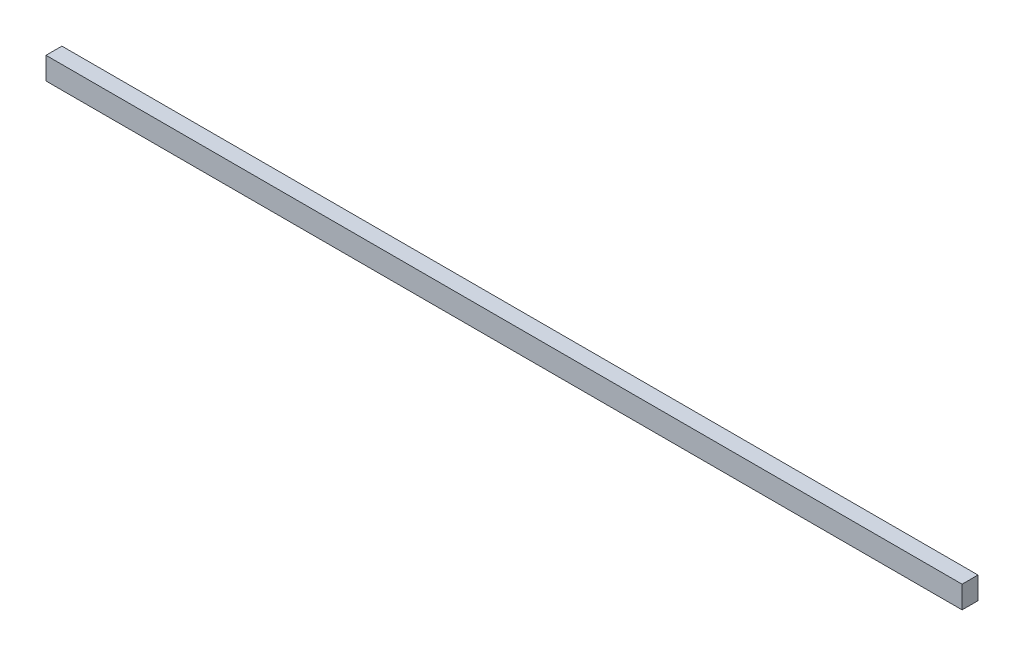
ISO-10303-21;
HEADER;
FILE_DESCRIPTION(('STEP AP214'),'2;1');
FILE_NAME('part.step','',(''),(''),'','','');
FILE_SCHEMA(('AUTOMOTIVE_DESIGN { 1 0 10303 214 1 1 1 1 }'));
ENDSEC;
DATA;
#1=APPLICATION_CONTEXT('core data for automotive mechanical design processes');
#2=APPLICATION_PROTOCOL_DEFINITION('international standard','automotive_design',2000,#1);
#3=PRODUCT_CONTEXT('',#1,'mechanical');
#4=PRODUCT('Part','Part','',(#3));
#5=PRODUCT_RELATED_PRODUCT_CATEGORY('part','',(#4));
#6=PRODUCT_DEFINITION_FORMATION('','',#4);
#7=PRODUCT_DEFINITION_CONTEXT('part definition',#1,'design');
#8=PRODUCT_DEFINITION('design','',#6,#7);
#9=PRODUCT_DEFINITION_SHAPE('','',#8);
#10=(LENGTH_UNIT() NAMED_UNIT(*) SI_UNIT(.MILLI.,.METRE.));
#11=(NAMED_UNIT(*) PLANE_ANGLE_UNIT() SI_UNIT($,.RADIAN.));
#12=(NAMED_UNIT(*) SI_UNIT($,.STERADIAN.) SOLID_ANGLE_UNIT());
#13=UNCERTAINTY_MEASURE_WITH_UNIT(LENGTH_MEASURE(1.E-05),#10,'distance_accuracy_value','');
#14=(GEOMETRIC_REPRESENTATION_CONTEXT(3) GLOBAL_UNCERTAINTY_ASSIGNED_CONTEXT((#13)) GLOBAL_UNIT_ASSIGNED_CONTEXT((#10,
#11,#12)) REPRESENTATION_CONTEXT('',''));
#15=CARTESIAN_POINT('',(0.,0.,0.));
#16=DIRECTION('',(0.,0.,1.));
#17=DIRECTION('',(1.,0.,0.));
#18=AXIS2_PLACEMENT_3D('',#15,#16,#17);
#19=CARTESIAN_POINT('',(-305.984811384745,-3.5,5.));
#20=DIRECTION('',(1.,0.,0.));
#21=DIRECTION('',(0.,0.,-1.));
#22=AXIS2_PLACEMENT_3D('',#19,#20,#21);
#23=PLANE('',#22);
#24=DIRECTION('',(0.,-1.,0.));
#25=VECTOR('',#24,1.);
#26=CARTESIAN_POINT('',(-305.984811384745,-3.5,0.));
#27=LINE('',#26,#25);
#28=CARTESIAN_POINT('',(-305.984811384745,3.5,0.));
#29=VERTEX_POINT('',#28);
#30=CARTESIAN_POINT('',(-305.984811384745,-3.5,0.));
#31=VERTEX_POINT('',#30);
#32=EDGE_CURVE('E98',#29,#31,#27,.T.);
#33=ORIENTED_EDGE('',*,*,#32,.T.);
#34=DIRECTION('',(0.,0.,-1.));
#35=VECTOR('',#34,1.);
#36=CARTESIAN_POINT('',(-305.984811384745,-3.5,5.));
#37=LINE('',#36,#35);
#38=CARTESIAN_POINT('',(-305.984811384745,-3.5,5.));
#39=VERTEX_POINT('',#38);
#40=EDGE_CURVE('E11',#39,#31,#37,.T.);
#41=ORIENTED_EDGE('',*,*,#40,.F.);
#42=DIRECTION('',(0.,-1.,0.));
#43=VECTOR('',#42,1.);
#44=CARTESIAN_POINT('',(-305.984811384745,-3.5,5.));
#45=LINE('',#44,#43);
#46=CARTESIAN_POINT('',(-305.984811384745,3.5,5.));
#47=VERTEX_POINT('',#46);
#48=EDGE_CURVE('E86',#47,#39,#45,.T.);
#49=ORIENTED_EDGE('',*,*,#48,.F.);
#50=DIRECTION('',(0.,0.,-1.));
#51=VECTOR('',#50,1.);
#52=CARTESIAN_POINT('',(-305.984811384745,3.5,5.));
#53=LINE('',#52,#51);
#54=EDGE_CURVE('E94',#47,#29,#53,.T.);
#55=ORIENTED_EDGE('',*,*,#54,.T.);
#56=EDGE_LOOP('',(#33,#41,#49,#55));
#57=FACE_BOUND('',#56,.T.);
#58=ADVANCED_FACE('F35',(#57),#23,.F.);
#59=CARTESIAN_POINT('',(-305.984811384745,-3.5,5.));
#60=DIRECTION('',(0.,1.,0.));
#61=DIRECTION('',(0.,0.,1.));
#62=AXIS2_PLACEMENT_3D('',#59,#60,#61);
#63=PLANE('',#62);
#64=DIRECTION('',(1.,0.,0.));
#65=VECTOR('',#64,1.);
#66=CARTESIAN_POINT('',(-305.984811384745,-3.5,0.));
#67=LINE('',#66,#65);
#68=CARTESIAN_POINT('',(-18.1324636652107,-3.5,0.));
#69=VERTEX_POINT('',#68);
#70=EDGE_CURVE('E90',#31,#69,#67,.T.);
#71=ORIENTED_EDGE('',*,*,#70,.T.);
#72=DIRECTION('',(0.,0.,-1.));
#73=VECTOR('',#72,1.);
#74=CARTESIAN_POINT('',(-18.1324636652107,-3.5,5.));
#75=LINE('',#74,#73);
#76=CARTESIAN_POINT('',(-18.1324636652107,-3.5,5.));
#77=VERTEX_POINT('',#76);
#78=EDGE_CURVE('E43',#77,#69,#75,.T.);
#79=ORIENTED_EDGE('',*,*,#78,.F.);
#80=DIRECTION('',(1.,0.,0.));
#81=VECTOR('',#80,1.);
#82=CARTESIAN_POINT('',(-305.984811384745,-3.5,5.));
#83=LINE('',#82,#81);
#84=EDGE_CURVE('E81',#39,#77,#83,.T.);
#85=ORIENTED_EDGE('',*,*,#84,.F.);
#86=ORIENTED_EDGE('',*,*,#40,.T.);
#87=EDGE_LOOP('',(#71,#79,#85,#86));
#88=FACE_BOUND('',#87,.T.);
#89=ADVANCED_FACE('F89',(#88),#63,.F.);
#90=CARTESIAN_POINT('',(-18.1324636652107,-3.5,5.));
#91=DIRECTION('',(-1.,0.,0.));
#92=DIRECTION('',(0.,-1.,0.));
#93=AXIS2_PLACEMENT_3D('',#90,#91,#92);
#94=PLANE('',#93);
#95=DIRECTION('',(0.,1.,0.));
#96=VECTOR('',#95,1.);
#97=CARTESIAN_POINT('',(-18.1324636652107,-3.5,0.));
#98=LINE('',#97,#96);
#99=CARTESIAN_POINT('',(-18.1324636652107,3.5,0.));
#100=VERTEX_POINT('',#99);
#101=EDGE_CURVE('E68',#69,#100,#98,.T.);
#102=ORIENTED_EDGE('',*,*,#101,.T.);
#103=DIRECTION('',(0.,0.,-1.));
#104=VECTOR('',#103,1.);
#105=CARTESIAN_POINT('',(-18.1324636652107,3.5,5.));
#106=LINE('',#105,#104);
#107=CARTESIAN_POINT('',(-18.1324636652107,3.5,5.));
#108=VERTEX_POINT('',#107);
#109=EDGE_CURVE('E91',#108,#100,#106,.T.);
#110=ORIENTED_EDGE('',*,*,#109,.F.);
#111=DIRECTION('',(0.,1.,0.));
#112=VECTOR('',#111,1.);
#113=CARTESIAN_POINT('',(-18.1324636652107,-3.5,5.));
#114=LINE('',#113,#112);
#115=EDGE_CURVE('E84',#77,#108,#114,.T.);
#116=ORIENTED_EDGE('',*,*,#115,.F.);
#117=ORIENTED_EDGE('',*,*,#78,.T.);
#118=EDGE_LOOP('',(#102,#110,#116,#117));
#119=FACE_BOUND('',#118,.T.);
#120=ADVANCED_FACE('F92',(#119),#94,.F.);
#121=CARTESIAN_POINT('',(-305.984811384745,3.5,5.));
#122=DIRECTION('',(0.,-1.,0.));
#123=DIRECTION('',(1.,0.,0.));
#124=AXIS2_PLACEMENT_3D('',#121,#122,#123);
#125=PLANE('',#124);
#126=DIRECTION('',(-1.,0.,0.));
#127=VECTOR('',#126,1.);
#128=CARTESIAN_POINT('',(-305.984811384745,3.5,0.));
#129=LINE('',#128,#127);
#130=EDGE_CURVE('E74',#100,#29,#129,.T.);
#131=ORIENTED_EDGE('',*,*,#130,.T.);
#132=ORIENTED_EDGE('',*,*,#54,.F.);
#133=DIRECTION('',(-1.,0.,0.));
#134=VECTOR('',#133,1.);
#135=CARTESIAN_POINT('',(-305.984811384745,3.5,5.));
#136=LINE('',#135,#134);
#137=EDGE_CURVE('E51',#108,#47,#136,.T.);
#138=ORIENTED_EDGE('',*,*,#137,.F.);
#139=ORIENTED_EDGE('',*,*,#109,.T.);
#140=EDGE_LOOP('',(#131,#132,#138,#139));
#141=FACE_BOUND('',#140,.T.);
#142=ADVANCED_FACE('F105',(#141),#125,.F.);
#143=CARTESIAN_POINT('',(0.,0.,5.));
#144=DIRECTION('',(0.,0.,-1.));
#145=DIRECTION('',(-1.,0.,0.));
#146=AXIS2_PLACEMENT_3D('',#143,#144,#145);
#147=PLANE('',#146);
#148=ORIENTED_EDGE('',*,*,#48,.T.);
#149=ORIENTED_EDGE('',*,*,#84,.T.);
#150=ORIENTED_EDGE('',*,*,#115,.T.);
#151=ORIENTED_EDGE('',*,*,#137,.T.);
#152=EDGE_LOOP('',(#148,#149,#150,#151));
#153=FACE_BOUND('',#152,.T.);
#154=ADVANCED_FACE('F82',(#153),#147,.F.);
#155=CARTESIAN_POINT('',(0.,0.,0.));
#156=DIRECTION('',(0.,0.,-1.));
#157=DIRECTION('',(-1.,0.,0.));
#158=AXIS2_PLACEMENT_3D('',#155,#156,#157);
#159=PLANE('',#158);
#160=ORIENTED_EDGE('',*,*,#32,.F.);
#161=ORIENTED_EDGE('',*,*,#130,.F.);
#162=ORIENTED_EDGE('',*,*,#101,.F.);
#163=ORIENTED_EDGE('',*,*,#70,.F.);
#164=EDGE_LOOP('',(#160,#161,#162,#163));
#165=FACE_BOUND('',#164,.T.);
#166=ADVANCED_FACE('F108',(#165),#159,.T.);
#167=CLOSED_SHELL('',(#58,#89,#120,#142,#154,#166));
#168=MANIFOLD_SOLID_BREP('B2',#167);
#169=ADVANCED_BREP_SHAPE_REPRESENTATION('',(#18,#168),#14);
#170=SHAPE_DEFINITION_REPRESENTATION(#9,#169);
ENDSEC;
END-ISO-10303-21;
